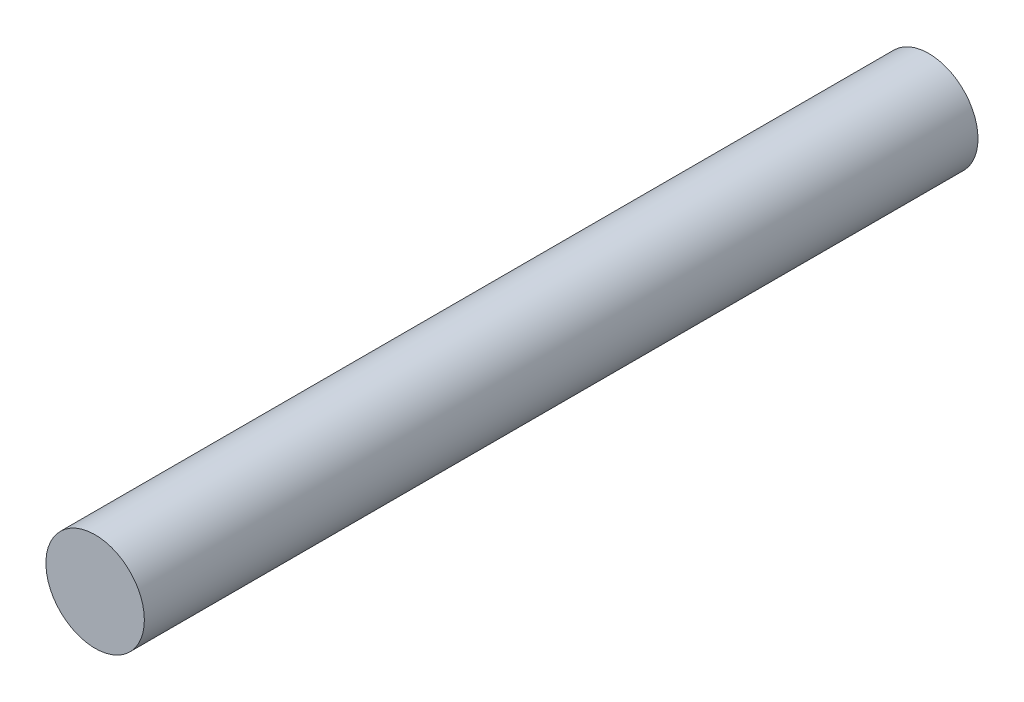
ISO-10303-21;
HEADER;
FILE_DESCRIPTION(('STEP AP214'),'2;1');
FILE_NAME('part.step','',(''),(''),'','','');
FILE_SCHEMA(('AUTOMOTIVE_DESIGN { 1 0 10303 214 1 1 1 1 }'));
ENDSEC;
DATA;
#1=APPLICATION_CONTEXT('core data for automotive mechanical design processes');
#2=APPLICATION_PROTOCOL_DEFINITION('international standard','automotive_design',2000,#1);
#3=PRODUCT_CONTEXT('',#1,'mechanical');
#4=PRODUCT('Part','Part','',(#3));
#5=PRODUCT_RELATED_PRODUCT_CATEGORY('part','',(#4));
#6=PRODUCT_DEFINITION_FORMATION('','',#4);
#7=PRODUCT_DEFINITION_CONTEXT('part definition',#1,'design');
#8=PRODUCT_DEFINITION('design','',#6,#7);
#9=PRODUCT_DEFINITION_SHAPE('','',#8);
#10=(LENGTH_UNIT() NAMED_UNIT(*) SI_UNIT(.MILLI.,.METRE.));
#11=(NAMED_UNIT(*) PLANE_ANGLE_UNIT() SI_UNIT($,.RADIAN.));
#12=(NAMED_UNIT(*) SI_UNIT($,.STERADIAN.) SOLID_ANGLE_UNIT());
#13=UNCERTAINTY_MEASURE_WITH_UNIT(LENGTH_MEASURE(1.E-05),#10,'distance_accuracy_value','');
#14=(GEOMETRIC_REPRESENTATION_CONTEXT(3) GLOBAL_UNCERTAINTY_ASSIGNED_CONTEXT((#13)) GLOBAL_UNIT_ASSIGNED_CONTEXT((#10,
#11,#12)) REPRESENTATION_CONTEXT('',''));
#15=CARTESIAN_POINT('',(0.,0.,0.));
#16=DIRECTION('',(0.,0.,1.));
#17=DIRECTION('',(1.,0.,0.));
#18=AXIS2_PLACEMENT_3D('',#15,#16,#17);
#19=CARTESIAN_POINT('',(0.,0.,50.8));
#20=DIRECTION('',(0.,0.,-1.));
#21=DIRECTION('',(-1.,0.,0.));
#22=AXIS2_PLACEMENT_3D('',#19,#20,#21);
#23=CYLINDRICAL_SURFACE('',#22,3.);
#24=CARTESIAN_POINT('',(0.,0.,50.8));
#25=DIRECTION('',(0.,0.,1.));
#26=DIRECTION('',(1.,0.,0.));
#27=AXIS2_PLACEMENT_3D('',#24,#25,#26);
#28=CIRCLE('',#27,3.);
#29=CARTESIAN_POINT('',(3.,0.,50.8));
#30=VERTEX_POINT('',#29);
#31=EDGE_CURVE('E10',#30,#30,#28,.T.);
#32=ORIENTED_EDGE('',*,*,#31,.F.);
#33=EDGE_LOOP('',(#32));
#34=FACE_BOUND('',#33,.T.);
#35=CARTESIAN_POINT('',(0.,0.,0.));
#36=DIRECTION('',(0.,0.,1.));
#37=DIRECTION('',(1.,0.,0.));
#38=AXIS2_PLACEMENT_3D('',#35,#36,#37);
#39=CIRCLE('',#38,3.);
#40=CARTESIAN_POINT('',(3.,0.,0.));
#41=VERTEX_POINT('',#40);
#42=EDGE_CURVE('E42',#41,#41,#39,.T.);
#43=ORIENTED_EDGE('',*,*,#42,.T.);
#44=EDGE_LOOP('',(#43));
#45=FACE_BOUND('',#44,.T.);
#46=ADVANCED_FACE('F39',(#34,#45),#23,.T.);
#47=CARTESIAN_POINT('',(0.,0.,50.8));
#48=DIRECTION('',(0.,0.,1.));
#49=DIRECTION('',(1.,0.,0.));
#50=AXIS2_PLACEMENT_3D('',#47,#48,#49);
#51=PLANE('',#50);
#52=ORIENTED_EDGE('',*,*,#31,.T.);
#53=EDGE_LOOP('',(#52));
#54=FACE_BOUND('',#53,.T.);
#55=ADVANCED_FACE('F54',(#54),#51,.T.);
#56=CARTESIAN_POINT('',(0.,0.,0.));
#57=DIRECTION('',(0.,0.,1.));
#58=DIRECTION('',(1.,0.,0.));
#59=AXIS2_PLACEMENT_3D('',#56,#57,#58);
#60=PLANE('',#59);
#61=ORIENTED_EDGE('',*,*,#42,.F.);
#62=EDGE_LOOP('',(#61));
#63=FACE_BOUND('',#62,.T.);
#64=ADVANCED_FACE('F52',(#63),#60,.F.);
#65=CLOSED_SHELL('',(#46,#55,#64));
#66=MANIFOLD_SOLID_BREP('B2',#65);
#67=ADVANCED_BREP_SHAPE_REPRESENTATION('',(#18,#66),#14);
#68=SHAPE_DEFINITION_REPRESENTATION(#9,#67);
ENDSEC;
END-ISO-10303-21;
